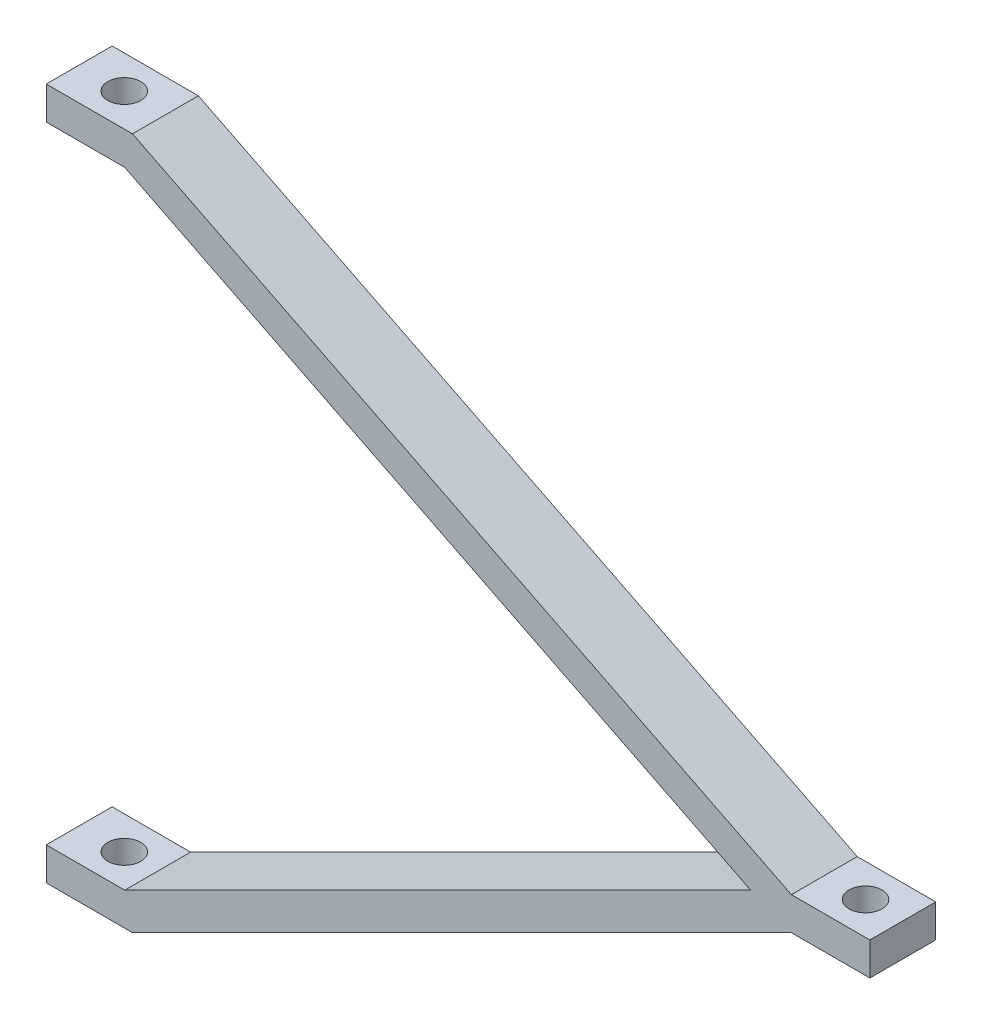
ISO-10303-21;
HEADER;
FILE_DESCRIPTION(('STEP AP214'),'2;1');
FILE_NAME('part.step','',(''),(''),'','','');
FILE_SCHEMA(('AUTOMOTIVE_DESIGN { 1 0 10303 214 1 1 1 1 }'));
ENDSEC;
DATA;
#1=APPLICATION_CONTEXT('core data for automotive mechanical design processes');
#2=APPLICATION_PROTOCOL_DEFINITION('international standard','automotive_design',2000,#1);
#3=PRODUCT_CONTEXT('',#1,'mechanical');
#4=PRODUCT('Part','Part','',(#3));
#5=PRODUCT_RELATED_PRODUCT_CATEGORY('part','',(#4));
#6=PRODUCT_DEFINITION_FORMATION('','',#4);
#7=PRODUCT_DEFINITION_CONTEXT('part definition',#1,'design');
#8=PRODUCT_DEFINITION('design','',#6,#7);
#9=PRODUCT_DEFINITION_SHAPE('','',#8);
#10=(LENGTH_UNIT() NAMED_UNIT(*) SI_UNIT(.MILLI.,.METRE.));
#11=(NAMED_UNIT(*) PLANE_ANGLE_UNIT() SI_UNIT($,.RADIAN.));
#12=(NAMED_UNIT(*) SI_UNIT($,.STERADIAN.) SOLID_ANGLE_UNIT());
#13=UNCERTAINTY_MEASURE_WITH_UNIT(LENGTH_MEASURE(1.E-05),#10,'distance_accuracy_value','');
#14=(GEOMETRIC_REPRESENTATION_CONTEXT(3) GLOBAL_UNCERTAINTY_ASSIGNED_CONTEXT((#13)) GLOBAL_UNIT_ASSIGNED_CONTEXT((#10,
#11,#12)) REPRESENTATION_CONTEXT('',''));
#15=CARTESIAN_POINT('',(0.,0.,0.));
#16=DIRECTION('',(0.,0.,1.));
#17=DIRECTION('',(1.,0.,0.));
#18=AXIS2_PLACEMENT_3D('',#15,#16,#17);
#19=CARTESIAN_POINT('',(0.,0.,20.));
#20=DIRECTION('',(0.,0.,1.));
#21=DIRECTION('',(1.,0.,0.));
#22=AXIS2_PLACEMENT_3D('',#19,#20,#21);
#23=PLANE('',#22);
#24=DIRECTION('',(-0.894427190999916,-0.447213595499958,0.));
#25=VECTOR('',#24,1.);
#26=CARTESIAN_POINT('',(202.2360679775,-4.47213595499957,20.));
#27=LINE('',#26,#25);
#28=CARTESIAN_POINT('',(201.180339887499,-4.99999999999996,20.));
#29=VERTEX_POINT('',#28);
#30=CARTESIAN_POINT('',(1.18033988749898,-105.,20.));
#31=VERTEX_POINT('',#30);
#32=EDGE_CURVE('E322',#29,#31,#27,.T.);
#33=ORIENTED_EDGE('',*,*,#32,.F.);
#34=DIRECTION('',(1.,0.,0.));
#35=VECTOR('',#34,1.);
#36=CARTESIAN_POINT('',(200.,-4.99999999999999,20.));
#37=LINE('',#36,#35);
#38=CARTESIAN_POINT('',(225.,-5.,20.));
#39=VERTEX_POINT('',#38);
#40=EDGE_CURVE('E287',#29,#39,#37,.T.);
#41=ORIENTED_EDGE('',*,*,#40,.T.);
#42=DIRECTION('',(0.,-1.,0.));
#43=VECTOR('',#42,1.);
#44=CARTESIAN_POINT('',(225.,5.,20.));
#45=LINE('',#44,#43);
#46=CARTESIAN_POINT('',(225.,5.,20.));
#47=VERTEX_POINT('',#46);
#48=EDGE_CURVE('E290',#47,#39,#45,.T.);
#49=ORIENTED_EDGE('',*,*,#48,.F.);
#50=DIRECTION('',(1.,0.,0.));
#51=VECTOR('',#50,1.);
#52=CARTESIAN_POINT('',(200.,5.00000000000001,20.));
#53=LINE('',#52,#51);
#54=CARTESIAN_POINT('',(201.180339887499,5.00000000000001,20.));
#55=VERTEX_POINT('',#54);
#56=EDGE_CURVE('E295',#55,#47,#53,.T.);
#57=ORIENTED_EDGE('',*,*,#56,.F.);
#58=DIRECTION('',(-0.894427190999916,0.447213595499958,0.));
#59=VECTOR('',#58,1.);
#60=CARTESIAN_POINT('',(202.2360679775,4.47213595499959,20.));
#61=LINE('',#60,#59);
#62=CARTESIAN_POINT('',(1.18033988749897,105.,20.));
#63=VERTEX_POINT('',#62);
#64=EDGE_CURVE('E342',#55,#63,#61,.T.);
#65=ORIENTED_EDGE('',*,*,#64,.T.);
#66=DIRECTION('',(1.,0.,0.));
#67=VECTOR('',#66,1.);
#68=CARTESIAN_POINT('',(0.,105.,20.));
#69=LINE('',#68,#67);
#70=CARTESIAN_POINT('',(-25.,105.,20.));
#71=VERTEX_POINT('',#70);
#72=EDGE_CURVE('E369',#63,#71,#69,.F.);
#73=ORIENTED_EDGE('',*,*,#72,.T.);
#74=DIRECTION('',(0.,1.,0.));
#75=VECTOR('',#74,1.);
#76=CARTESIAN_POINT('',(-25.,95.,20.));
#77=LINE('',#76,#75);
#78=CARTESIAN_POINT('',(-25.,95.,20.));
#79=VERTEX_POINT('',#78);
#80=EDGE_CURVE('E349',#79,#71,#77,.T.);
#81=ORIENTED_EDGE('',*,*,#80,.F.);
#82=DIRECTION('',(1.,0.,0.));
#83=VECTOR('',#82,1.);
#84=CARTESIAN_POINT('',(0.,95.,20.));
#85=LINE('',#84,#83);
#86=CARTESIAN_POINT('',(-1.18033988749891,95.,20.));
#87=VERTEX_POINT('',#86);
#88=EDGE_CURVE('E337',#87,#79,#85,.F.);
#89=ORIENTED_EDGE('',*,*,#88,.F.);
#90=DIRECTION('',(-0.894427190999916,0.447213595499958,0.));
#91=VECTOR('',#90,1.);
#92=CARTESIAN_POINT('',(197.7639320225,-4.47213595499957,20.));
#93=LINE('',#92,#91);
#94=CARTESIAN_POINT('',(188.819660112501,0.,20.));
#95=VERTEX_POINT('',#94);
#96=EDGE_CURVE('E333',#95,#87,#93,.T.);
#97=ORIENTED_EDGE('',*,*,#96,.F.);
#98=DIRECTION('',(-0.894427190999916,-0.447213595499958,0.));
#99=VECTOR('',#98,1.);
#100=CARTESIAN_POINT('',(197.7639320225,4.47213595499959,20.));
#101=LINE('',#100,#99);
#102=CARTESIAN_POINT('',(-1.18033988749892,-95.,20.));
#103=VERTEX_POINT('',#102);
#104=EDGE_CURVE('E231',#95,#103,#101,.T.);
#105=ORIENTED_EDGE('',*,*,#104,.T.);
#106=DIRECTION('',(1.,0.,0.));
#107=VECTOR('',#106,1.);
#108=CARTESIAN_POINT('',(0.,-95.,20.));
#109=LINE('',#108,#107);
#110=CARTESIAN_POINT('',(-25.,-95.,20.));
#111=VERTEX_POINT('',#110);
#112=EDGE_CURVE('E222',#103,#111,#109,.F.);
#113=ORIENTED_EDGE('',*,*,#112,.T.);
#114=DIRECTION('',(0.,1.,0.));
#115=VECTOR('',#114,1.);
#116=CARTESIAN_POINT('',(-25.,-105.,20.));
#117=LINE('',#116,#115);
#118=CARTESIAN_POINT('',(-25.,-105.,20.));
#119=VERTEX_POINT('',#118);
#120=EDGE_CURVE('E315',#119,#111,#117,.T.);
#121=ORIENTED_EDGE('',*,*,#120,.F.);
#122=DIRECTION('',(1.,0.,0.));
#123=VECTOR('',#122,1.);
#124=CARTESIAN_POINT('',(0.,-105.,20.));
#125=LINE('',#124,#123);
#126=EDGE_CURVE('E319',#31,#119,#125,.F.);
#127=ORIENTED_EDGE('',*,*,#126,.F.);
#128=EDGE_LOOP('',(#33,#41,#49,#57,#65,#73,#81,#89,#97,#105,#113,#121,#127));
#129=FACE_BOUND('',#128,.T.);
#130=ADVANCED_FACE('F139',(#129),#23,.T.);
#131=CARTESIAN_POINT('',(0.,0.,0.));
#132=DIRECTION('',(0.,0.,1.));
#133=DIRECTION('',(1.,0.,0.));
#134=AXIS2_PLACEMENT_3D('',#131,#132,#133);
#135=PLANE('',#134);
#136=DIRECTION('',(1.,0.,0.));
#137=VECTOR('',#136,1.);
#138=CARTESIAN_POINT('',(200.,-4.99999999999999,0.));
#139=LINE('',#138,#137);
#140=CARTESIAN_POINT('',(201.180339887499,-4.99999999999996,0.));
#141=VERTEX_POINT('',#140);
#142=CARTESIAN_POINT('',(225.,-5.,0.));
#143=VERTEX_POINT('',#142);
#144=EDGE_CURVE('E261',#141,#143,#139,.T.);
#145=ORIENTED_EDGE('',*,*,#144,.F.);
#146=DIRECTION('',(-0.894427190999916,-0.447213595499958,0.));
#147=VECTOR('',#146,1.);
#148=CARTESIAN_POINT('',(202.2360679775,-4.47213595499957,0.));
#149=LINE('',#148,#147);
#150=CARTESIAN_POINT('',(1.18033988749898,-105.,0.));
#151=VERTEX_POINT('',#150);
#152=EDGE_CURVE('E205',#141,#151,#149,.T.);
#153=ORIENTED_EDGE('',*,*,#152,.T.);
#154=DIRECTION('',(1.,0.,0.));
#155=VECTOR('',#154,1.);
#156=CARTESIAN_POINT('',(0.,-105.,0.));
#157=LINE('',#156,#155);
#158=CARTESIAN_POINT('',(-25.,-105.,0.));
#159=VERTEX_POINT('',#158);
#160=EDGE_CURVE('E241',#151,#159,#157,.F.);
#161=ORIENTED_EDGE('',*,*,#160,.T.);
#162=DIRECTION('',(0.,1.,0.));
#163=VECTOR('',#162,1.);
#164=CARTESIAN_POINT('',(-25.,-105.,0.));
#165=LINE('',#164,#163);
#166=CARTESIAN_POINT('',(-25.,-95.,0.));
#167=VERTEX_POINT('',#166);
#168=EDGE_CURVE('E235',#159,#167,#165,.T.);
#169=ORIENTED_EDGE('',*,*,#168,.T.);
#170=DIRECTION('',(1.,0.,0.));
#171=VECTOR('',#170,1.);
#172=CARTESIAN_POINT('',(0.,-95.,0.));
#173=LINE('',#172,#171);
#174=CARTESIAN_POINT('',(-1.18033988749892,-95.,0.));
#175=VERTEX_POINT('',#174);
#176=EDGE_CURVE('E227',#175,#167,#173,.F.);
#177=ORIENTED_EDGE('',*,*,#176,.F.);
#178=DIRECTION('',(-0.894427190999916,-0.447213595499958,0.));
#179=VECTOR('',#178,1.);
#180=CARTESIAN_POINT('',(197.7639320225,4.47213595499959,0.));
#181=LINE('',#180,#179);
#182=CARTESIAN_POINT('',(188.819660112501,0.,0.));
#183=VERTEX_POINT('',#182);
#184=EDGE_CURVE('E212',#183,#175,#181,.T.);
#185=ORIENTED_EDGE('',*,*,#184,.F.);
#186=DIRECTION('',(-0.894427190999916,0.447213595499958,0.));
#187=VECTOR('',#186,1.);
#188=CARTESIAN_POINT('',(197.7639320225,-4.47213595499957,0.));
#189=LINE('',#188,#187);
#190=CARTESIAN_POINT('',(-1.18033988749891,95.,0.));
#191=VERTEX_POINT('',#190);
#192=EDGE_CURVE('E363',#183,#191,#189,.T.);
#193=ORIENTED_EDGE('',*,*,#192,.T.);
#194=DIRECTION('',(1.,0.,0.));
#195=VECTOR('',#194,1.);
#196=CARTESIAN_POINT('',(0.,95.,0.));
#197=LINE('',#196,#195);
#198=CARTESIAN_POINT('',(-25.,95.,0.));
#199=VERTEX_POINT('',#198);
#200=EDGE_CURVE('E359',#191,#199,#197,.F.);
#201=ORIENTED_EDGE('',*,*,#200,.T.);
#202=DIRECTION('',(0.,1.,0.));
#203=VECTOR('',#202,1.);
#204=CARTESIAN_POINT('',(-25.,95.,0.));
#205=LINE('',#204,#203);
#206=CARTESIAN_POINT('',(-25.,105.,0.));
#207=VERTEX_POINT('',#206);
#208=EDGE_CURVE('E355',#199,#207,#205,.T.);
#209=ORIENTED_EDGE('',*,*,#208,.T.);
#210=DIRECTION('',(1.,0.,0.));
#211=VECTOR('',#210,1.);
#212=CARTESIAN_POINT('',(0.,105.,0.));
#213=LINE('',#212,#211);
#214=CARTESIAN_POINT('',(1.18033988749897,105.,0.));
#215=VERTEX_POINT('',#214);
#216=EDGE_CURVE('E264',#215,#207,#213,.F.);
#217=ORIENTED_EDGE('',*,*,#216,.F.);
#218=DIRECTION('',(-0.894427190999916,0.447213595499958,0.));
#219=VECTOR('',#218,1.);
#220=CARTESIAN_POINT('',(202.2360679775,4.47213595499959,0.));
#221=LINE('',#220,#219);
#222=CARTESIAN_POINT('',(201.180339887499,5.00000000000001,0.));
#223=VERTEX_POINT('',#222);
#224=EDGE_CURVE('E366',#223,#215,#221,.T.);
#225=ORIENTED_EDGE('',*,*,#224,.F.);
#226=DIRECTION('',(1.,0.,0.));
#227=VECTOR('',#226,1.);
#228=CARTESIAN_POINT('',(200.,5.00000000000001,0.));
#229=LINE('',#228,#227);
#230=CARTESIAN_POINT('',(225.,5.,0.));
#231=VERTEX_POINT('',#230);
#232=EDGE_CURVE('E291',#223,#231,#229,.T.);
#233=ORIENTED_EDGE('',*,*,#232,.T.);
#234=DIRECTION('',(0.,-1.,0.));
#235=VECTOR('',#234,1.);
#236=CARTESIAN_POINT('',(225.,5.,0.));
#237=LINE('',#236,#235);
#238=EDGE_CURVE('E301',#231,#143,#237,.T.);
#239=ORIENTED_EDGE('',*,*,#238,.T.);
#240=EDGE_LOOP('',(#145,#153,#161,#169,#177,#185,#193,#201,#209,#217,#225,#233,#239));
#241=FACE_BOUND('',#240,.T.);
#242=ADVANCED_FACE('F233',(#241),#135,.F.);
#243=CARTESIAN_POINT('',(202.2360679775,4.47213595499959,20.));
#244=DIRECTION('',(-0.447213595499958,-0.894427190999916,0.));
#245=DIRECTION('',(0.894427190999916,-0.447213595499958,0.));
#246=AXIS2_PLACEMENT_3D('',#243,#244,#245);
#247=PLANE('',#246);
#248=ORIENTED_EDGE('',*,*,#64,.F.);
#249=DIRECTION('',(0.,0.,-1.));
#250=VECTOR('',#249,1.);
#251=CARTESIAN_POINT('',(201.180339887499,5.00000000000001,20.));
#252=LINE('',#251,#250);
#253=EDGE_CURVE('E150',#55,#223,#252,.T.);
#254=ORIENTED_EDGE('',*,*,#253,.T.);
#255=ORIENTED_EDGE('',*,*,#224,.T.);
#256=DIRECTION('',(0.,0.,-1.));
#257=VECTOR('',#256,1.);
#258=CARTESIAN_POINT('',(1.18033988749897,105.,20.));
#259=LINE('',#258,#257);
#260=EDGE_CURVE('E347',#63,#215,#259,.T.);
#261=ORIENTED_EDGE('',*,*,#260,.F.);
#262=EDGE_LOOP('',(#248,#254,#255,#261));
#263=FACE_BOUND('',#262,.T.);
#264=ADVANCED_FACE('F442',(#263),#247,.F.);
#265=CARTESIAN_POINT('',(0.,105.,20.));
#266=DIRECTION('',(0.,-1.,0.));
#267=DIRECTION('',(0.,0.,-1.));
#268=AXIS2_PLACEMENT_3D('',#265,#266,#267);
#269=PLANE('',#268);
#270=CARTESIAN_POINT('',(-11.319660112501,105.,10.));
#271=DIRECTION('',(0.,-1.,0.));
#272=DIRECTION('',(0.,0.,-1.));
#273=AXIS2_PLACEMENT_3D('',#270,#271,#272);
#274=CIRCLE('',#273,5.);
#275=CARTESIAN_POINT('',(-11.319660112501,105.,5.));
#276=VERTEX_POINT('',#275);
#277=EDGE_CURVE('E237',#276,#276,#274,.T.);
#278=ORIENTED_EDGE('',*,*,#277,.T.);
#279=EDGE_LOOP('',(#278));
#280=FACE_BOUND('',#279,.T.);
#281=ORIENTED_EDGE('',*,*,#216,.T.);
#282=DIRECTION('',(0.,0.,-1.));
#283=VECTOR('',#282,1.);
#284=CARTESIAN_POINT('',(-25.,105.,20.));
#285=LINE('',#284,#283);
#286=EDGE_CURVE('E267',#71,#207,#285,.T.);
#287=ORIENTED_EDGE('',*,*,#286,.F.);
#288=ORIENTED_EDGE('',*,*,#72,.F.);
#289=ORIENTED_EDGE('',*,*,#260,.T.);
#290=EDGE_LOOP('',(#281,#287,#288,#289));
#291=FACE_BOUND('',#290,.T.);
#292=ADVANCED_FACE('F400',(#280,#291),#269,.F.);
#293=CARTESIAN_POINT('',(-25.,95.,20.));
#294=DIRECTION('',(-1.,0.,0.));
#295=DIRECTION('',(0.,0.,1.));
#296=AXIS2_PLACEMENT_3D('',#293,#294,#295);
#297=PLANE('',#296);
#298=ORIENTED_EDGE('',*,*,#208,.F.);
#299=DIRECTION('',(0.,0.,-1.));
#300=VECTOR('',#299,1.);
#301=CARTESIAN_POINT('',(-25.,95.,20.));
#302=LINE('',#301,#300);
#303=EDGE_CURVE('E274',#79,#199,#302,.T.);
#304=ORIENTED_EDGE('',*,*,#303,.F.);
#305=ORIENTED_EDGE('',*,*,#80,.T.);
#306=ORIENTED_EDGE('',*,*,#286,.T.);
#307=EDGE_LOOP('',(#298,#304,#305,#306));
#308=FACE_BOUND('',#307,.T.);
#309=ADVANCED_FACE('F401',(#308),#297,.T.);
#310=CARTESIAN_POINT('',(0.,95.,20.));
#311=DIRECTION('',(0.,-1.,0.));
#312=DIRECTION('',(0.,0.,-1.));
#313=AXIS2_PLACEMENT_3D('',#310,#311,#312);
#314=PLANE('',#313);
#315=CARTESIAN_POINT('',(-11.319660112501,95.,10.));
#316=DIRECTION('',(0.,-1.,0.));
#317=DIRECTION('',(0.,0.,-1.));
#318=AXIS2_PLACEMENT_3D('',#315,#316,#317);
#319=CIRCLE('',#318,5.);
#320=CARTESIAN_POINT('',(-11.319660112501,95.,5.));
#321=VERTEX_POINT('',#320);
#322=EDGE_CURVE('E244',#321,#321,#319,.T.);
#323=ORIENTED_EDGE('',*,*,#322,.F.);
#324=EDGE_LOOP('',(#323));
#325=FACE_BOUND('',#324,.T.);
#326=ORIENTED_EDGE('',*,*,#200,.F.);
#327=DIRECTION('',(0.,0.,-1.));
#328=VECTOR('',#327,1.);
#329=CARTESIAN_POINT('',(-1.18033988749891,95.,20.));
#330=LINE('',#329,#328);
#331=EDGE_CURVE('E283',#87,#191,#330,.T.);
#332=ORIENTED_EDGE('',*,*,#331,.F.);
#333=ORIENTED_EDGE('',*,*,#88,.T.);
#334=ORIENTED_EDGE('',*,*,#303,.T.);
#335=EDGE_LOOP('',(#326,#332,#333,#334));
#336=FACE_BOUND('',#335,.T.);
#337=ADVANCED_FACE('F380',(#325,#336),#314,.T.);
#338=CARTESIAN_POINT('',(197.7639320225,-4.47213595499957,20.));
#339=DIRECTION('',(-0.447213595499958,-0.894427190999916,0.));
#340=DIRECTION('',(0.894427190999916,-0.447213595499958,0.));
#341=AXIS2_PLACEMENT_3D('',#338,#339,#340);
#342=PLANE('',#341);
#343=ORIENTED_EDGE('',*,*,#192,.F.);
#344=DIRECTION('',(0.,0.,1.));
#345=VECTOR('',#344,1.);
#346=CARTESIAN_POINT('',(188.819660112501,0.,20.));
#347=LINE('',#346,#345);
#348=EDGE_CURVE('E12',#183,#95,#347,.T.);
#349=ORIENTED_EDGE('',*,*,#348,.T.);
#350=ORIENTED_EDGE('',*,*,#96,.T.);
#351=ORIENTED_EDGE('',*,*,#331,.T.);
#352=EDGE_LOOP('',(#343,#349,#350,#351));
#353=FACE_BOUND('',#352,.T.);
#354=ADVANCED_FACE('F375',(#353),#342,.T.);
#355=CARTESIAN_POINT('',(197.7639320225,4.47213595499959,20.));
#356=DIRECTION('',(0.447213595499958,-0.894427190999916,0.));
#357=DIRECTION('',(0.894427190999916,0.447213595499958,0.));
#358=AXIS2_PLACEMENT_3D('',#355,#356,#357);
#359=PLANE('',#358);
#360=ORIENTED_EDGE('',*,*,#348,.F.);
#361=ORIENTED_EDGE('',*,*,#184,.T.);
#362=DIRECTION('',(0.,0.,-1.));
#363=VECTOR('',#362,1.);
#364=CARTESIAN_POINT('',(-1.18033988749892,-95.,20.));
#365=LINE('',#364,#363);
#366=EDGE_CURVE('E216',#103,#175,#365,.T.);
#367=ORIENTED_EDGE('',*,*,#366,.F.);
#368=ORIENTED_EDGE('',*,*,#104,.F.);
#369=EDGE_LOOP('',(#360,#361,#367,#368));
#370=FACE_BOUND('',#369,.T.);
#371=ADVANCED_FACE('F214',(#370),#359,.F.);
#372=CARTESIAN_POINT('',(0.,-95.,20.));
#373=DIRECTION('',(0.,-1.,0.));
#374=DIRECTION('',(0.,0.,-1.));
#375=AXIS2_PLACEMENT_3D('',#372,#373,#374);
#376=PLANE('',#375);
#377=CARTESIAN_POINT('',(-11.319660112501,-95.,10.));
#378=DIRECTION('',(0.,-1.,0.));
#379=DIRECTION('',(0.,0.,-1.));
#380=AXIS2_PLACEMENT_3D('',#377,#378,#379);
#381=CIRCLE('',#380,5.);
#382=CARTESIAN_POINT('',(-11.319660112501,-95.,5.));
#383=VERTEX_POINT('',#382);
#384=EDGE_CURVE('E407',#383,#383,#381,.T.);
#385=ORIENTED_EDGE('',*,*,#384,.T.);
#386=EDGE_LOOP('',(#385));
#387=FACE_BOUND('',#386,.T.);
#388=ORIENTED_EDGE('',*,*,#176,.T.);
#389=DIRECTION('',(0.,0.,-1.));
#390=VECTOR('',#389,1.);
#391=CARTESIAN_POINT('',(-25.,-95.,20.));
#392=LINE('',#391,#390);
#393=EDGE_CURVE('E258',#111,#167,#392,.T.);
#394=ORIENTED_EDGE('',*,*,#393,.F.);
#395=ORIENTED_EDGE('',*,*,#112,.F.);
#396=ORIENTED_EDGE('',*,*,#366,.T.);
#397=EDGE_LOOP('',(#388,#394,#395,#396));
#398=FACE_BOUND('',#397,.T.);
#399=ADVANCED_FACE('F141',(#387,#398),#376,.F.);
#400=CARTESIAN_POINT('',(-25.,-105.,20.));
#401=DIRECTION('',(-1.,0.,0.));
#402=DIRECTION('',(0.,0.,1.));
#403=AXIS2_PLACEMENT_3D('',#400,#401,#402);
#404=PLANE('',#403);
#405=ORIENTED_EDGE('',*,*,#168,.F.);
#406=DIRECTION('',(0.,0.,-1.));
#407=VECTOR('',#406,1.);
#408=CARTESIAN_POINT('',(-25.,-105.,20.));
#409=LINE('',#408,#407);
#410=EDGE_CURVE('E255',#119,#159,#409,.T.);
#411=ORIENTED_EDGE('',*,*,#410,.F.);
#412=ORIENTED_EDGE('',*,*,#120,.T.);
#413=ORIENTED_EDGE('',*,*,#393,.T.);
#414=EDGE_LOOP('',(#405,#411,#412,#413));
#415=FACE_BOUND('',#414,.T.);
#416=ADVANCED_FACE('F483',(#415),#404,.T.);
#417=CARTESIAN_POINT('',(0.,-105.,20.));
#418=DIRECTION('',(0.,-1.,0.));
#419=DIRECTION('',(0.,0.,-1.));
#420=AXIS2_PLACEMENT_3D('',#417,#418,#419);
#421=PLANE('',#420);
#422=CARTESIAN_POINT('',(-11.319660112501,-105.,10.));
#423=DIRECTION('',(0.,-1.,0.));
#424=DIRECTION('',(0.,0.,-1.));
#425=AXIS2_PLACEMENT_3D('',#422,#423,#424);
#426=CIRCLE('',#425,5.);
#427=CARTESIAN_POINT('',(-11.319660112501,-105.,5.));
#428=VERTEX_POINT('',#427);
#429=EDGE_CURVE('E415',#428,#428,#426,.T.);
#430=ORIENTED_EDGE('',*,*,#429,.F.);
#431=EDGE_LOOP('',(#430));
#432=FACE_BOUND('',#431,.T.);
#433=ORIENTED_EDGE('',*,*,#160,.F.);
#434=DIRECTION('',(0.,0.,-1.));
#435=VECTOR('',#434,1.);
#436=CARTESIAN_POINT('',(1.18033988749898,-105.,20.));
#437=LINE('',#436,#435);
#438=EDGE_CURVE('E230',#31,#151,#437,.T.);
#439=ORIENTED_EDGE('',*,*,#438,.F.);
#440=ORIENTED_EDGE('',*,*,#126,.T.);
#441=ORIENTED_EDGE('',*,*,#410,.T.);
#442=EDGE_LOOP('',(#433,#439,#440,#441));
#443=FACE_BOUND('',#442,.T.);
#444=ADVANCED_FACE('F490',(#432,#443),#421,.T.);
#445=CARTESIAN_POINT('',(202.2360679775,-4.47213595499957,20.));
#446=DIRECTION('',(0.447213595499958,-0.894427190999916,0.));
#447=DIRECTION('',(0.894427190999916,0.447213595499958,0.));
#448=AXIS2_PLACEMENT_3D('',#445,#446,#447);
#449=PLANE('',#448);
#450=DIRECTION('',(0.,0.,-1.));
#451=VECTOR('',#450,1.);
#452=CARTESIAN_POINT('',(201.180339887499,-4.99999999999999,20.));
#453=LINE('',#452,#451);
#454=EDGE_CURVE('E262',#29,#141,#453,.T.);
#455=ORIENTED_EDGE('',*,*,#454,.F.);
#456=ORIENTED_EDGE('',*,*,#32,.T.);
#457=ORIENTED_EDGE('',*,*,#438,.T.);
#458=ORIENTED_EDGE('',*,*,#152,.F.);
#459=EDGE_LOOP('',(#455,#456,#457,#458));
#460=FACE_BOUND('',#459,.T.);
#461=ADVANCED_FACE('F497',(#460),#449,.T.);
#462=CARTESIAN_POINT('',(200.,-4.99999999999999,20.));
#463=DIRECTION('',(0.,1.,0.));
#464=DIRECTION('',(-1.,0.,0.));
#465=AXIS2_PLACEMENT_3D('',#462,#463,#464);
#466=PLANE('',#465);
#467=CARTESIAN_POINT('',(213.680339887499,-5.,10.));
#468=DIRECTION('',(0.,1.,0.));
#469=DIRECTION('',(-1.,0.,0.));
#470=AXIS2_PLACEMENT_3D('',#467,#468,#469);
#471=CIRCLE('',#470,4.99999999999999);
#472=CARTESIAN_POINT('',(208.680339887499,-5.,10.));
#473=VERTEX_POINT('',#472);
#474=EDGE_CURVE('E411',#473,#473,#471,.T.);
#475=ORIENTED_EDGE('',*,*,#474,.T.);
#476=EDGE_LOOP('',(#475));
#477=FACE_BOUND('',#476,.T.);
#478=ORIENTED_EDGE('',*,*,#40,.F.);
#479=ORIENTED_EDGE('',*,*,#454,.T.);
#480=ORIENTED_EDGE('',*,*,#144,.T.);
#481=DIRECTION('',(0.,0.,-1.));
#482=VECTOR('',#481,1.);
#483=CARTESIAN_POINT('',(225.,-5.,20.));
#484=LINE('',#483,#482);
#485=EDGE_CURVE('E265',#39,#143,#484,.T.);
#486=ORIENTED_EDGE('',*,*,#485,.F.);
#487=EDGE_LOOP('',(#478,#479,#480,#486));
#488=FACE_BOUND('',#487,.T.);
#489=ADVANCED_FACE('F437',(#477,#488),#466,.F.);
#490=CARTESIAN_POINT('',(225.,5.,20.));
#491=DIRECTION('',(1.,0.,0.));
#492=DIRECTION('',(0.,0.,-1.));
#493=AXIS2_PLACEMENT_3D('',#490,#491,#492);
#494=PLANE('',#493);
#495=ORIENTED_EDGE('',*,*,#238,.F.);
#496=DIRECTION('',(0.,0.,-1.));
#497=VECTOR('',#496,1.);
#498=CARTESIAN_POINT('',(225.,5.,20.));
#499=LINE('',#498,#497);
#500=EDGE_CURVE('E298',#47,#231,#499,.T.);
#501=ORIENTED_EDGE('',*,*,#500,.F.);
#502=ORIENTED_EDGE('',*,*,#48,.T.);
#503=ORIENTED_EDGE('',*,*,#485,.T.);
#504=EDGE_LOOP('',(#495,#501,#502,#503));
#505=FACE_BOUND('',#504,.T.);
#506=ADVANCED_FACE('F429',(#505),#494,.T.);
#507=CARTESIAN_POINT('',(200.,5.00000000000001,20.));
#508=DIRECTION('',(0.,1.,0.));
#509=DIRECTION('',(-1.,0.,0.));
#510=AXIS2_PLACEMENT_3D('',#507,#508,#509);
#511=PLANE('',#510);
#512=CARTESIAN_POINT('',(213.680339887499,5.,10.));
#513=DIRECTION('',(0.,1.,0.));
#514=DIRECTION('',(-1.,0.,0.));
#515=AXIS2_PLACEMENT_3D('',#512,#513,#514);
#516=CIRCLE('',#515,4.99999999999999);
#517=CARTESIAN_POINT('',(208.680339887499,5.00000000000001,10.));
#518=VERTEX_POINT('',#517);
#519=EDGE_CURVE('E143',#518,#518,#516,.T.);
#520=ORIENTED_EDGE('',*,*,#519,.F.);
#521=EDGE_LOOP('',(#520));
#522=FACE_BOUND('',#521,.T.);
#523=ORIENTED_EDGE('',*,*,#253,.F.);
#524=ORIENTED_EDGE('',*,*,#56,.T.);
#525=ORIENTED_EDGE('',*,*,#500,.T.);
#526=ORIENTED_EDGE('',*,*,#232,.F.);
#527=EDGE_LOOP('',(#523,#524,#525,#526));
#528=FACE_BOUND('',#527,.T.);
#529=ADVANCED_FACE('F427',(#522,#528),#511,.T.);
#530=CARTESIAN_POINT('',(213.680339887499,130.,10.));
#531=DIRECTION('',(0.,-1.,0.));
#532=DIRECTION('',(0.,0.,-1.));
#533=AXIS2_PLACEMENT_3D('',#530,#531,#532);
#534=CYLINDRICAL_SURFACE('',#533,4.99999999999999);
#535=ORIENTED_EDGE('',*,*,#519,.T.);
#536=EDGE_LOOP('',(#535));
#537=FACE_BOUND('',#536,.T.);
#538=ORIENTED_EDGE('',*,*,#474,.F.);
#539=EDGE_LOOP('',(#538));
#540=FACE_BOUND('',#539,.T.);
#541=ADVANCED_FACE('F424',(#537,#540),#534,.F.);
#542=CARTESIAN_POINT('',(-11.319660112501,130.,10.));
#543=DIRECTION('',(0.,-1.,0.));
#544=DIRECTION('',(0.,0.,-1.));
#545=AXIS2_PLACEMENT_3D('',#542,#543,#544);
#546=CYLINDRICAL_SURFACE('',#545,5.);
#547=ORIENTED_EDGE('',*,*,#429,.T.);
#548=EDGE_LOOP('',(#547));
#549=FACE_BOUND('',#548,.T.);
#550=ORIENTED_EDGE('',*,*,#384,.F.);
#551=EDGE_LOOP('',(#550));
#552=FACE_BOUND('',#551,.T.);
#553=ADVANCED_FACE('F435',(#549,#552),#546,.F.);
#554=ORIENTED_EDGE('',*,*,#322,.T.);
#555=EDGE_LOOP('',(#554));
#556=FACE_BOUND('',#555,.T.);
#557=ORIENTED_EDGE('',*,*,#277,.F.);
#558=EDGE_LOOP('',(#557));
#559=FACE_BOUND('',#558,.T.);
#560=ADVANCED_FACE('F584',(#556,#559),#546,.F.);
#561=CLOSED_SHELL('',(#130,#242,#264,#292,#309,#337,#354,#371,#399,#416,#444,#461,#489,#506,
#529,#541,#553,#560));
#562=MANIFOLD_SOLID_BREP('B2',#561);
#563=ADVANCED_BREP_SHAPE_REPRESENTATION('',(#18,#562),#14);
#564=SHAPE_DEFINITION_REPRESENTATION(#9,#563);
ENDSEC;
END-ISO-10303-21;
